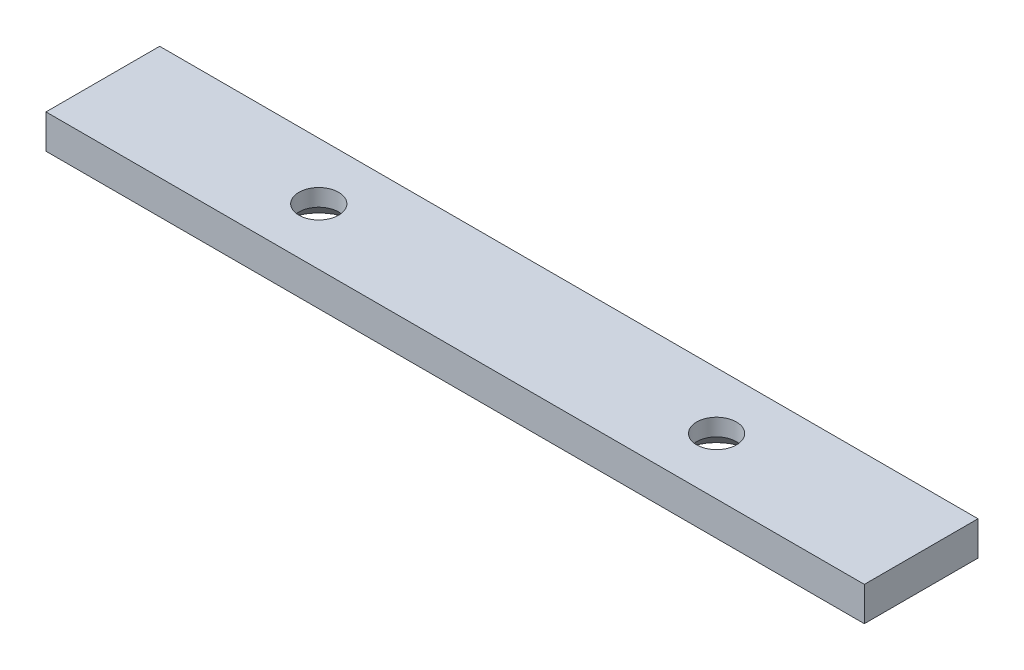
ISO-10303-21;
HEADER;
FILE_DESCRIPTION(('STEP AP214'),'2;1');
FILE_NAME('part.step','',(''),(''),'','','');
FILE_SCHEMA(('AUTOMOTIVE_DESIGN { 1 0 10303 214 1 1 1 1 }'));
ENDSEC;
DATA;
#1=APPLICATION_CONTEXT('core data for automotive mechanical design processes');
#2=APPLICATION_PROTOCOL_DEFINITION('international standard','automotive_design',2000,#1);
#3=PRODUCT_CONTEXT('',#1,'mechanical');
#4=PRODUCT('Part','Part','',(#3));
#5=PRODUCT_RELATED_PRODUCT_CATEGORY('part','',(#4));
#6=PRODUCT_DEFINITION_FORMATION('','',#4);
#7=PRODUCT_DEFINITION_CONTEXT('part definition',#1,'design');
#8=PRODUCT_DEFINITION('design','',#6,#7);
#9=PRODUCT_DEFINITION_SHAPE('','',#8);
#10=(LENGTH_UNIT() NAMED_UNIT(*) SI_UNIT(.MILLI.,.METRE.));
#11=(NAMED_UNIT(*) PLANE_ANGLE_UNIT() SI_UNIT($,.RADIAN.));
#12=(NAMED_UNIT(*) SI_UNIT($,.STERADIAN.) SOLID_ANGLE_UNIT());
#13=UNCERTAINTY_MEASURE_WITH_UNIT(LENGTH_MEASURE(1.E-05),#10,'distance_accuracy_value','');
#14=(GEOMETRIC_REPRESENTATION_CONTEXT(3) GLOBAL_UNCERTAINTY_ASSIGNED_CONTEXT((#13)) GLOBAL_UNIT_ASSIGNED_CONTEXT((#10,
#11,#12)) REPRESENTATION_CONTEXT('',''));
#15=CARTESIAN_POINT('',(0.,0.,0.));
#16=DIRECTION('',(0.,0.,1.));
#17=DIRECTION('',(1.,0.,0.));
#18=AXIS2_PLACEMENT_3D('',#15,#16,#17);
#19=CARTESIAN_POINT('',(0.,0.,0.));
#20=DIRECTION('',(0.,1.,0.));
#21=DIRECTION('',(0.,0.,1.));
#22=AXIS2_PLACEMENT_3D('',#19,#20,#21);
#23=PLANE('',#22);
#24=CARTESIAN_POINT('',(36.,0.,0.));
#25=DIRECTION('',(0.,-1.,0.));
#26=DIRECTION('',(0.,0.,-1.));
#27=AXIS2_PLACEMENT_3D('',#24,#25,#26);
#28=CIRCLE('',#27,6.5);
#29=CARTESIAN_POINT('',(36.,0.,-6.5));
#30=VERTEX_POINT('',#29);
#31=EDGE_CURVE('E146',#30,#30,#28,.T.);
#32=ORIENTED_EDGE('',*,*,#31,.F.);
#33=EDGE_LOOP('',(#32));
#34=FACE_BOUND('',#33,.T.);
#35=DIRECTION('',(0.,0.,1.));
#36=VECTOR('',#35,1.);
#37=CARTESIAN_POINT('',(-72.,0.,-10.));
#38=LINE('',#37,#36);
#39=CARTESIAN_POINT('',(-72.,0.,-10.));
#40=VERTEX_POINT('',#39);
#41=CARTESIAN_POINT('',(-72.,0.,10.));
#42=VERTEX_POINT('',#41);
#43=EDGE_CURVE('E108',#40,#42,#38,.T.);
#44=ORIENTED_EDGE('',*,*,#43,.F.);
#45=DIRECTION('',(1.,0.,0.));
#46=VECTOR('',#45,1.);
#47=CARTESIAN_POINT('',(-72.,0.,-10.));
#48=LINE('',#47,#46);
#49=CARTESIAN_POINT('',(72.,0.,-10.));
#50=VERTEX_POINT('',#49);
#51=EDGE_CURVE('E117',#40,#50,#48,.T.);
#52=ORIENTED_EDGE('',*,*,#51,.T.);
#53=DIRECTION('',(0.,0.,1.));
#54=VECTOR('',#53,1.);
#55=CARTESIAN_POINT('',(72.,0.,-10.));
#56=LINE('',#55,#54);
#57=CARTESIAN_POINT('',(72.,0.,10.));
#58=VERTEX_POINT('',#57);
#59=EDGE_CURVE('E114',#50,#58,#56,.T.);
#60=ORIENTED_EDGE('',*,*,#59,.T.);
#61=DIRECTION('',(1.,0.,0.));
#62=VECTOR('',#61,1.);
#63=CARTESIAN_POINT('',(-72.,0.,10.));
#64=LINE('',#63,#62);
#65=EDGE_CURVE('E96',#42,#58,#64,.T.);
#66=ORIENTED_EDGE('',*,*,#65,.F.);
#67=EDGE_LOOP('',(#44,#52,#60,#66));
#68=FACE_BOUND('',#67,.T.);
#69=CARTESIAN_POINT('',(-34.,0.,0.));
#70=DIRECTION('',(0.,-1.,0.));
#71=DIRECTION('',(0.,0.,-1.));
#72=AXIS2_PLACEMENT_3D('',#69,#70,#71);
#73=CIRCLE('',#72,6.5);
#74=CARTESIAN_POINT('',(-34.,0.,-6.5));
#75=VERTEX_POINT('',#74);
#76=EDGE_CURVE('E134',#75,#75,#73,.T.);
#77=ORIENTED_EDGE('',*,*,#76,.F.);
#78=EDGE_LOOP('',(#77));
#79=FACE_BOUND('',#78,.T.);
#80=ADVANCED_FACE('F39',(#34,#68,#79),#23,.F.);
#81=CARTESIAN_POINT('',(-72.,6.,-10.));
#82=DIRECTION('',(1.,0.,0.));
#83=DIRECTION('',(0.,0.,-1.));
#84=AXIS2_PLACEMENT_3D('',#81,#82,#83);
#85=PLANE('',#84);
#86=ORIENTED_EDGE('',*,*,#43,.T.);
#87=DIRECTION('',(0.,-1.,0.));
#88=VECTOR('',#87,1.);
#89=CARTESIAN_POINT('',(-72.,6.,10.));
#90=LINE('',#89,#88);
#91=CARTESIAN_POINT('',(-72.,6.,10.));
#92=VERTEX_POINT('',#91);
#93=EDGE_CURVE('E11',#92,#42,#90,.T.);
#94=ORIENTED_EDGE('',*,*,#93,.F.);
#95=DIRECTION('',(0.,0.,1.));
#96=VECTOR('',#95,1.);
#97=CARTESIAN_POINT('',(-72.,6.,-10.));
#98=LINE('',#97,#96);
#99=CARTESIAN_POINT('',(-72.,6.,-10.));
#100=VERTEX_POINT('',#99);
#101=EDGE_CURVE('E90',#100,#92,#98,.T.);
#102=ORIENTED_EDGE('',*,*,#101,.F.);
#103=DIRECTION('',(0.,-1.,0.));
#104=VECTOR('',#103,1.);
#105=CARTESIAN_POINT('',(-72.,6.,-10.));
#106=LINE('',#105,#104);
#107=EDGE_CURVE('E57',#100,#40,#106,.T.);
#108=ORIENTED_EDGE('',*,*,#107,.T.);
#109=EDGE_LOOP('',(#86,#94,#102,#108));
#110=FACE_BOUND('',#109,.T.);
#111=ADVANCED_FACE('F41',(#110),#85,.F.);
#112=CARTESIAN_POINT('',(-72.,6.,10.));
#113=DIRECTION('',(0.,0.,-1.));
#114=DIRECTION('',(-1.,0.,0.));
#115=AXIS2_PLACEMENT_3D('',#112,#113,#114);
#116=PLANE('',#115);
#117=ORIENTED_EDGE('',*,*,#65,.T.);
#118=DIRECTION('',(0.,-1.,0.));
#119=VECTOR('',#118,1.);
#120=CARTESIAN_POINT('',(72.,6.,10.));
#121=LINE('',#120,#119);
#122=CARTESIAN_POINT('',(72.,6.,10.));
#123=VERTEX_POINT('',#122);
#124=EDGE_CURVE('E49',#123,#58,#121,.T.);
#125=ORIENTED_EDGE('',*,*,#124,.F.);
#126=DIRECTION('',(1.,0.,0.));
#127=VECTOR('',#126,1.);
#128=CARTESIAN_POINT('',(-72.,6.,10.));
#129=LINE('',#128,#127);
#130=EDGE_CURVE('E82',#92,#123,#129,.T.);
#131=ORIENTED_EDGE('',*,*,#130,.F.);
#132=ORIENTED_EDGE('',*,*,#93,.T.);
#133=EDGE_LOOP('',(#117,#125,#131,#132));
#134=FACE_BOUND('',#133,.T.);
#135=ADVANCED_FACE('F95',(#134),#116,.F.);
#136=CARTESIAN_POINT('',(72.,6.,-10.));
#137=DIRECTION('',(1.,0.,0.));
#138=DIRECTION('',(0.,0.,-1.));
#139=AXIS2_PLACEMENT_3D('',#136,#137,#138);
#140=PLANE('',#139);
#141=ORIENTED_EDGE('',*,*,#59,.F.);
#142=DIRECTION('',(0.,-1.,0.));
#143=VECTOR('',#142,1.);
#144=CARTESIAN_POINT('',(72.,6.,-10.));
#145=LINE('',#144,#143);
#146=CARTESIAN_POINT('',(72.,6.,-10.));
#147=VERTEX_POINT('',#146);
#148=EDGE_CURVE('E71',#147,#50,#145,.T.);
#149=ORIENTED_EDGE('',*,*,#148,.F.);
#150=DIRECTION('',(0.,0.,1.));
#151=VECTOR('',#150,1.);
#152=CARTESIAN_POINT('',(72.,6.,-10.));
#153=LINE('',#152,#151);
#154=EDGE_CURVE('E89',#147,#123,#153,.T.);
#155=ORIENTED_EDGE('',*,*,#154,.T.);
#156=ORIENTED_EDGE('',*,*,#124,.T.);
#157=EDGE_LOOP('',(#141,#149,#155,#156));
#158=FACE_BOUND('',#157,.T.);
#159=ADVANCED_FACE('F100',(#158),#140,.T.);
#160=CARTESIAN_POINT('',(-72.,6.,-10.));
#161=DIRECTION('',(0.,0.,-1.));
#162=DIRECTION('',(-1.,0.,0.));
#163=AXIS2_PLACEMENT_3D('',#160,#161,#162);
#164=PLANE('',#163);
#165=ORIENTED_EDGE('',*,*,#51,.F.);
#166=ORIENTED_EDGE('',*,*,#107,.F.);
#167=DIRECTION('',(1.,0.,0.));
#168=VECTOR('',#167,1.);
#169=CARTESIAN_POINT('',(-72.,6.,-10.));
#170=LINE('',#169,#168);
#171=EDGE_CURVE('E102',#100,#147,#170,.T.);
#172=ORIENTED_EDGE('',*,*,#171,.T.);
#173=ORIENTED_EDGE('',*,*,#148,.T.);
#174=EDGE_LOOP('',(#165,#166,#172,#173));
#175=FACE_BOUND('',#174,.T.);
#176=ADVANCED_FACE('F176',(#175),#164,.T.);
#177=CARTESIAN_POINT('',(0.,6.,0.));
#178=DIRECTION('',(0.,1.,0.));
#179=DIRECTION('',(0.,0.,1.));
#180=AXIS2_PLACEMENT_3D('',#177,#178,#179);
#181=PLANE('',#180);
#182=CARTESIAN_POINT('',(36.,6.,0.));
#183=DIRECTION('',(0.,1.,0.));
#184=DIRECTION('',(0.,0.,1.));
#185=AXIS2_PLACEMENT_3D('',#182,#183,#184);
#186=CIRCLE('',#185,3.5);
#187=CARTESIAN_POINT('',(36.,6.,3.5));
#188=VERTEX_POINT('',#187);
#189=EDGE_CURVE('E142',#188,#188,#186,.T.);
#190=ORIENTED_EDGE('',*,*,#189,.F.);
#191=EDGE_LOOP('',(#190));
#192=FACE_BOUND('',#191,.T.);
#193=CARTESIAN_POINT('',(-34.,6.,0.));
#194=DIRECTION('',(0.,1.,0.));
#195=DIRECTION('',(0.,0.,1.));
#196=AXIS2_PLACEMENT_3D('',#193,#194,#195);
#197=CIRCLE('',#196,3.5);
#198=CARTESIAN_POINT('',(-34.,6.,3.5));
#199=VERTEX_POINT('',#198);
#200=EDGE_CURVE('E111',#199,#199,#197,.T.);
#201=ORIENTED_EDGE('',*,*,#200,.F.);
#202=EDGE_LOOP('',(#201));
#203=FACE_BOUND('',#202,.T.);
#204=ORIENTED_EDGE('',*,*,#101,.T.);
#205=ORIENTED_EDGE('',*,*,#130,.T.);
#206=ORIENTED_EDGE('',*,*,#154,.F.);
#207=ORIENTED_EDGE('',*,*,#171,.F.);
#208=EDGE_LOOP('',(#204,#205,#206,#207));
#209=FACE_BOUND('',#208,.T.);
#210=ADVANCED_FACE('F86',(#192,#203,#209),#181,.T.);
#211=CARTESIAN_POINT('',(-34.,0.,0.));
#212=DIRECTION('',(0.,-1.,0.));
#213=DIRECTION('',(0.,0.,-1.));
#214=AXIS2_PLACEMENT_3D('',#211,#212,#213);
#215=CYLINDRICAL_SURFACE('',#214,3.5);
#216=CARTESIAN_POINT('',(-34.,3.,0.));
#217=DIRECTION('',(0.,-1.,0.));
#218=DIRECTION('',(0.,0.,-1.));
#219=AXIS2_PLACEMENT_3D('',#216,#217,#218);
#220=CIRCLE('',#219,3.5);
#221=CARTESIAN_POINT('',(-34.,3.,-3.5));
#222=VERTEX_POINT('',#221);
#223=EDGE_CURVE('E130',#222,#222,#220,.T.);
#224=ORIENTED_EDGE('',*,*,#223,.T.);
#225=EDGE_LOOP('',(#224));
#226=FACE_BOUND('',#225,.T.);
#227=ORIENTED_EDGE('',*,*,#200,.T.);
#228=EDGE_LOOP('',(#227));
#229=FACE_BOUND('',#228,.T.);
#230=ADVANCED_FACE('F161',(#226,#229),#215,.F.);
#231=CARTESIAN_POINT('',(-34.,0.,0.));
#232=DIRECTION('',(0.,-1.,0.));
#233=DIRECTION('',(0.,0.,-1.));
#234=AXIS2_PLACEMENT_3D('',#231,#232,#233);
#235=CONICAL_SURFACE('',#234,6.5,0.785398163397448);
#236=ORIENTED_EDGE('',*,*,#223,.F.);
#237=EDGE_LOOP('',(#236));
#238=FACE_BOUND('',#237,.T.);
#239=ORIENTED_EDGE('',*,*,#76,.T.);
#240=EDGE_LOOP('',(#239));
#241=FACE_BOUND('',#240,.T.);
#242=ADVANCED_FACE('F158',(#238,#241),#235,.F.);
#243=CARTESIAN_POINT('',(36.,0.,0.));
#244=DIRECTION('',(0.,-1.,0.));
#245=DIRECTION('',(0.,0.,-1.));
#246=AXIS2_PLACEMENT_3D('',#243,#244,#245);
#247=CYLINDRICAL_SURFACE('',#246,3.5);
#248=CARTESIAN_POINT('',(36.,3.,0.));
#249=DIRECTION('',(0.,-1.,0.));
#250=DIRECTION('',(0.,0.,-1.));
#251=AXIS2_PLACEMENT_3D('',#248,#249,#250);
#252=CIRCLE('',#251,3.5);
#253=CARTESIAN_POINT('',(36.,3.,-3.5));
#254=VERTEX_POINT('',#253);
#255=EDGE_CURVE('E138',#254,#254,#252,.T.);
#256=ORIENTED_EDGE('',*,*,#255,.T.);
#257=EDGE_LOOP('',(#256));
#258=FACE_BOUND('',#257,.T.);
#259=ORIENTED_EDGE('',*,*,#189,.T.);
#260=EDGE_LOOP('',(#259));
#261=FACE_BOUND('',#260,.T.);
#262=ADVANCED_FACE('F160',(#258,#261),#247,.F.);
#263=CARTESIAN_POINT('',(36.,0.,0.));
#264=DIRECTION('',(0.,-1.,0.));
#265=DIRECTION('',(0.,0.,-1.));
#266=AXIS2_PLACEMENT_3D('',#263,#264,#265);
#267=CONICAL_SURFACE('',#266,6.5,0.785398163397448);
#268=ORIENTED_EDGE('',*,*,#255,.F.);
#269=EDGE_LOOP('',(#268));
#270=FACE_BOUND('',#269,.T.);
#271=ORIENTED_EDGE('',*,*,#31,.T.);
#272=EDGE_LOOP('',(#271));
#273=FACE_BOUND('',#272,.T.);
#274=ADVANCED_FACE('F151',(#270,#273),#267,.F.);
#275=CLOSED_SHELL('',(#80,#111,#135,#159,#176,#210,#230,#242,#262,#274));
#276=MANIFOLD_SOLID_BREP('B2',#275);
#277=ADVANCED_BREP_SHAPE_REPRESENTATION('',(#18,#276),#14);
#278=SHAPE_DEFINITION_REPRESENTATION(#9,#277);
ENDSEC;
END-ISO-10303-21;
